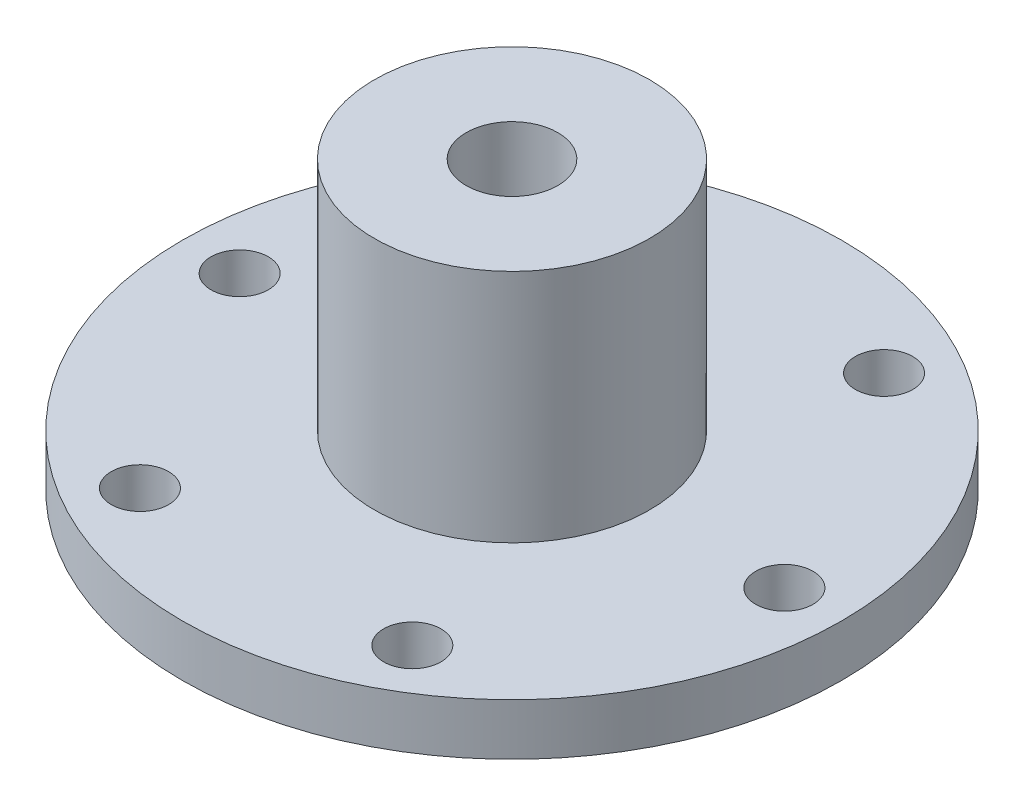
ISO-10303-21;
HEADER;
FILE_DESCRIPTION(('STEP AP214'),'2;1');
FILE_NAME('part.step','',(''),(''),'','','');
FILE_SCHEMA(('AUTOMOTIVE_DESIGN { 1 0 10303 214 1 1 1 1 }'));
ENDSEC;
DATA;
#1=APPLICATION_CONTEXT('core data for automotive mechanical design processes');
#2=APPLICATION_PROTOCOL_DEFINITION('international standard','automotive_design',2000,#1);
#3=PRODUCT_CONTEXT('',#1,'mechanical');
#4=PRODUCT('Part','Part','',(#3));
#5=PRODUCT_RELATED_PRODUCT_CATEGORY('part','',(#4));
#6=PRODUCT_DEFINITION_FORMATION('','',#4);
#7=PRODUCT_DEFINITION_CONTEXT('part definition',#1,'design');
#8=PRODUCT_DEFINITION('design','',#6,#7);
#9=PRODUCT_DEFINITION_SHAPE('','',#8);
#10=(LENGTH_UNIT() NAMED_UNIT(*) SI_UNIT(.MILLI.,.METRE.));
#11=(NAMED_UNIT(*) PLANE_ANGLE_UNIT() SI_UNIT($,.RADIAN.));
#12=(NAMED_UNIT(*) SI_UNIT($,.STERADIAN.) SOLID_ANGLE_UNIT());
#13=UNCERTAINTY_MEASURE_WITH_UNIT(LENGTH_MEASURE(1.E-05),#10,'distance_accuracy_value','');
#14=(GEOMETRIC_REPRESENTATION_CONTEXT(3) GLOBAL_UNCERTAINTY_ASSIGNED_CONTEXT((#13)) GLOBAL_UNIT_ASSIGNED_CONTEXT((#10,
#11,#12)) REPRESENTATION_CONTEXT('',''));
#15=CARTESIAN_POINT('',(0.,0.,0.));
#16=DIRECTION('',(0.,0.,1.));
#17=DIRECTION('',(1.,0.,0.));
#18=AXIS2_PLACEMENT_3D('',#15,#16,#17);
#19=CARTESIAN_POINT('',(0.,0.,0.));
#20=DIRECTION('',(0.,-1.,0.));
#21=DIRECTION('',(0.,0.,-1.));
#22=AXIS2_PLACEMENT_3D('',#19,#20,#21);
#23=CYLINDRICAL_SURFACE('',#22,4.);
#24=CARTESIAN_POINT('',(0.,0.,0.));
#25=DIRECTION('',(0.,-1.,0.));
#26=DIRECTION('',(0.,0.,-1.));
#27=AXIS2_PLACEMENT_3D('',#24,#25,#26);
#28=CIRCLE('',#27,4.);
#29=CARTESIAN_POINT('',(0.,0.,-4.));
#30=VERTEX_POINT('',#29);
#31=EDGE_CURVE('E10',#30,#30,#28,.T.);
#32=ORIENTED_EDGE('',*,*,#31,.T.);
#33=EDGE_LOOP('',(#32));
#34=FACE_BOUND('',#33,.T.);
#35=CARTESIAN_POINT('',(0.,25.,0.));
#36=DIRECTION('',(0.,-1.,0.));
#37=DIRECTION('',(0.,0.,-1.));
#38=AXIS2_PLACEMENT_3D('',#35,#36,#37);
#39=CIRCLE('',#38,4.);
#40=CARTESIAN_POINT('',(0.,25.,-4.));
#41=VERTEX_POINT('',#40);
#42=EDGE_CURVE('E66',#41,#41,#39,.T.);
#43=ORIENTED_EDGE('',*,*,#42,.F.);
#44=EDGE_LOOP('',(#43));
#45=FACE_BOUND('',#44,.T.);
#46=ADVANCED_FACE('F33',(#34,#45),#23,.F.);
#47=CARTESIAN_POINT('',(4.,0.,0.));
#48=DIRECTION('',(0.,-1.,0.));
#49=DIRECTION('',(0.,0.,-1.));
#50=AXIS2_PLACEMENT_3D('',#47,#48,#49);
#51=PLANE('',#50);
#52=CARTESIAN_POINT('',(23.75,0.,0.));
#53=DIRECTION('',(0.,-1.,0.));
#54=DIRECTION('',(0.,0.,-1.));
#55=AXIS2_PLACEMENT_3D('',#52,#53,#54);
#56=CIRCLE('',#55,2.5);
#57=CARTESIAN_POINT('',(23.75,0.,-2.5));
#58=VERTEX_POINT('',#57);
#59=EDGE_CURVE('E53',#58,#58,#56,.T.);
#60=ORIENTED_EDGE('',*,*,#59,.F.);
#61=EDGE_LOOP('',(#60));
#62=FACE_BOUND('',#61,.T.);
#63=CARTESIAN_POINT('',(11.8750000000002,0.,20.5681033398803));
#64=DIRECTION('',(0.,-1.,0.));
#65=DIRECTION('',(0.,0.,-1.));
#66=AXIS2_PLACEMENT_3D('',#63,#64,#65);
#67=CIRCLE('',#66,2.5);
#68=CARTESIAN_POINT('',(11.8750000000002,0.,18.0681033398803));
#69=VERTEX_POINT('',#68);
#70=EDGE_CURVE('E117',#69,#69,#67,.T.);
#71=ORIENTED_EDGE('',*,*,#70,.F.);
#72=EDGE_LOOP('',(#71));
#73=FACE_BOUND('',#72,.T.);
#74=CARTESIAN_POINT('',(-11.8749999999998,0.,20.5681033398805));
#75=DIRECTION('',(0.,-1.,0.));
#76=DIRECTION('',(0.,0.,-1.));
#77=AXIS2_PLACEMENT_3D('',#74,#75,#76);
#78=CIRCLE('',#77,2.5);
#79=CARTESIAN_POINT('',(-11.8749999999998,0.,18.0681033398805));
#80=VERTEX_POINT('',#79);
#81=EDGE_CURVE('E121',#80,#80,#78,.T.);
#82=ORIENTED_EDGE('',*,*,#81,.F.);
#83=EDGE_LOOP('',(#82));
#84=FACE_BOUND('',#83,.T.);
#85=CARTESIAN_POINT('',(11.8749999999997,0.,-20.5681033398806));
#86=DIRECTION('',(0.,-1.,0.));
#87=DIRECTION('',(0.,0.,-1.));
#88=AXIS2_PLACEMENT_3D('',#85,#86,#87);
#89=CIRCLE('',#88,2.5);
#90=CARTESIAN_POINT('',(11.8749999999997,0.,-23.0681033398806));
#91=VERTEX_POINT('',#90);
#92=EDGE_CURVE('E78',#91,#91,#89,.T.);
#93=ORIENTED_EDGE('',*,*,#92,.F.);
#94=EDGE_LOOP('',(#93));
#95=FACE_BOUND('',#94,.T.);
#96=CARTESIAN_POINT('',(-11.8750000000001,0.,-20.5681033398804));
#97=DIRECTION('',(0.,-1.,0.));
#98=DIRECTION('',(0.,0.,-1.));
#99=AXIS2_PLACEMENT_3D('',#96,#97,#98);
#100=CIRCLE('',#99,2.49999999999999);
#101=CARTESIAN_POINT('',(-11.8750000000001,0.,-23.0681033398804));
#102=VERTEX_POINT('',#101);
#103=EDGE_CURVE('E128',#102,#102,#100,.T.);
#104=ORIENTED_EDGE('',*,*,#103,.F.);
#105=EDGE_LOOP('',(#104));
#106=FACE_BOUND('',#105,.T.);
#107=CARTESIAN_POINT('',(-23.75,0.,1.68210386814043E-13));
#108=DIRECTION('',(0.,-1.,0.));
#109=DIRECTION('',(0.,0.,-1.));
#110=AXIS2_PLACEMENT_3D('',#107,#108,#109);
#111=CIRCLE('',#110,2.5);
#112=CARTESIAN_POINT('',(-23.75,0.,-2.49999999999983));
#113=VERTEX_POINT('',#112);
#114=EDGE_CURVE('E132',#113,#113,#111,.T.);
#115=ORIENTED_EDGE('',*,*,#114,.F.);
#116=EDGE_LOOP('',(#115));
#117=FACE_BOUND('',#116,.T.);
#118=CARTESIAN_POINT('',(0.,0.,0.));
#119=DIRECTION('',(0.,-1.,0.));
#120=DIRECTION('',(0.,0.,-1.));
#121=AXIS2_PLACEMENT_3D('',#118,#119,#120);
#122=CIRCLE('',#121,28.75);
#123=CARTESIAN_POINT('',(0.,0.,-28.75));
#124=VERTEX_POINT('',#123);
#125=EDGE_CURVE('E40',#124,#124,#122,.T.);
#126=ORIENTED_EDGE('',*,*,#125,.T.);
#127=EDGE_LOOP('',(#126));
#128=FACE_BOUND('',#127,.T.);
#129=ORIENTED_EDGE('',*,*,#31,.F.);
#130=EDGE_LOOP('',(#129));
#131=FACE_BOUND('',#130,.T.);
#132=ADVANCED_FACE('F100',(#62,#73,#84,#95,#106,#117,#128,#131),#51,.T.);
#133=CARTESIAN_POINT('',(0.,0.,0.));
#134=DIRECTION('',(0.,-1.,0.));
#135=DIRECTION('',(0.,0.,-1.));
#136=AXIS2_PLACEMENT_3D('',#133,#134,#135);
#137=CYLINDRICAL_SURFACE('',#136,28.75);
#138=CARTESIAN_POINT('',(0.,4.5,0.));
#139=DIRECTION('',(0.,-1.,0.));
#140=DIRECTION('',(0.,0.,-1.));
#141=AXIS2_PLACEMENT_3D('',#138,#139,#140);
#142=CIRCLE('',#141,28.75);
#143=CARTESIAN_POINT('',(0.,4.5,-28.75));
#144=VERTEX_POINT('',#143);
#145=EDGE_CURVE('E45',#144,#144,#142,.T.);
#146=ORIENTED_EDGE('',*,*,#145,.T.);
#147=EDGE_LOOP('',(#146));
#148=FACE_BOUND('',#147,.T.);
#149=ORIENTED_EDGE('',*,*,#125,.F.);
#150=EDGE_LOOP('',(#149));
#151=FACE_BOUND('',#150,.T.);
#152=ADVANCED_FACE('F85',(#148,#151),#137,.T.);
#153=CARTESIAN_POINT('',(28.75,4.5,0.));
#154=DIRECTION('',(0.,1.,0.));
#155=DIRECTION('',(0.,0.,1.));
#156=AXIS2_PLACEMENT_3D('',#153,#154,#155);
#157=PLANE('',#156);
#158=CARTESIAN_POINT('',(23.75,4.5,0.));
#159=DIRECTION('',(0.,1.,0.));
#160=DIRECTION('',(0.,0.,1.));
#161=AXIS2_PLACEMENT_3D('',#158,#159,#160);
#162=CIRCLE('',#161,2.5);
#163=CARTESIAN_POINT('',(23.75,4.5,-2.5));
#164=VERTEX_POINT('',#163);
#165=EDGE_CURVE('E36',#164,#164,#162,.T.);
#166=ORIENTED_EDGE('',*,*,#165,.F.);
#167=EDGE_LOOP('',(#166));
#168=FACE_BOUND('',#167,.T.);
#169=CARTESIAN_POINT('',(11.8750000000002,4.5,20.5681033398803));
#170=DIRECTION('',(0.,1.,0.));
#171=DIRECTION('',(0.,0.,1.));
#172=AXIS2_PLACEMENT_3D('',#169,#170,#171);
#173=CIRCLE('',#172,2.5);
#174=CARTESIAN_POINT('',(11.8750000000002,4.5,18.0681033398803));
#175=VERTEX_POINT('',#174);
#176=EDGE_CURVE('E61',#175,#175,#173,.T.);
#177=ORIENTED_EDGE('',*,*,#176,.F.);
#178=EDGE_LOOP('',(#177));
#179=FACE_BOUND('',#178,.T.);
#180=CARTESIAN_POINT('',(-11.8749999999998,4.5,20.5681033398805));
#181=DIRECTION('',(0.,1.,0.));
#182=DIRECTION('',(0.,0.,1.));
#183=AXIS2_PLACEMENT_3D('',#180,#181,#182);
#184=CIRCLE('',#183,2.5);
#185=CARTESIAN_POINT('',(-11.8749999999998,4.5,18.0681033398805));
#186=VERTEX_POINT('',#185);
#187=EDGE_CURVE('E59',#186,#186,#184,.T.);
#188=ORIENTED_EDGE('',*,*,#187,.F.);
#189=EDGE_LOOP('',(#188));
#190=FACE_BOUND('',#189,.T.);
#191=CARTESIAN_POINT('',(11.8749999999997,4.5,-20.5681033398806));
#192=DIRECTION('',(0.,1.,0.));
#193=DIRECTION('',(0.,0.,1.));
#194=AXIS2_PLACEMENT_3D('',#191,#192,#193);
#195=CIRCLE('',#194,2.5);
#196=CARTESIAN_POINT('',(11.8749999999997,4.5,-23.0681033398806));
#197=VERTEX_POINT('',#196);
#198=EDGE_CURVE('E56',#197,#197,#195,.T.);
#199=ORIENTED_EDGE('',*,*,#198,.F.);
#200=EDGE_LOOP('',(#199));
#201=FACE_BOUND('',#200,.T.);
#202=CARTESIAN_POINT('',(-11.8750000000001,4.5,-20.5681033398804));
#203=DIRECTION('',(0.,1.,0.));
#204=DIRECTION('',(0.,0.,1.));
#205=AXIS2_PLACEMENT_3D('',#202,#203,#204);
#206=CIRCLE('',#205,2.49999999999999);
#207=CARTESIAN_POINT('',(-11.8750000000001,4.5,-23.0681033398804));
#208=VERTEX_POINT('',#207);
#209=EDGE_CURVE('E52',#208,#208,#206,.T.);
#210=ORIENTED_EDGE('',*,*,#209,.F.);
#211=EDGE_LOOP('',(#210));
#212=FACE_BOUND('',#211,.T.);
#213=CARTESIAN_POINT('',(-23.75,4.5,1.68210386814043E-13));
#214=DIRECTION('',(0.,1.,0.));
#215=DIRECTION('',(0.,0.,1.));
#216=AXIS2_PLACEMENT_3D('',#213,#214,#215);
#217=CIRCLE('',#216,2.5);
#218=CARTESIAN_POINT('',(-23.75,4.5,-2.49999999999983));
#219=VERTEX_POINT('',#218);
#220=EDGE_CURVE('E49',#219,#219,#217,.T.);
#221=ORIENTED_EDGE('',*,*,#220,.F.);
#222=EDGE_LOOP('',(#221));
#223=FACE_BOUND('',#222,.T.);
#224=CARTESIAN_POINT('',(0.,4.5,0.));
#225=DIRECTION('',(0.,-1.,0.));
#226=DIRECTION('',(0.,0.,-1.));
#227=AXIS2_PLACEMENT_3D('',#224,#225,#226);
#228=CIRCLE('',#227,12.);
#229=CARTESIAN_POINT('',(0.,4.5,-12.));
#230=VERTEX_POINT('',#229);
#231=EDGE_CURVE('E75',#230,#230,#228,.T.);
#232=ORIENTED_EDGE('',*,*,#231,.T.);
#233=EDGE_LOOP('',(#232));
#234=FACE_BOUND('',#233,.T.);
#235=ORIENTED_EDGE('',*,*,#145,.F.);
#236=EDGE_LOOP('',(#235));
#237=FACE_BOUND('',#236,.T.);
#238=ADVANCED_FACE('F88',(#168,#179,#190,#201,#212,#223,#234,#237),#157,.T.);
#239=CARTESIAN_POINT('',(0.,0.,0.));
#240=DIRECTION('',(0.,-1.,0.));
#241=DIRECTION('',(0.,0.,-1.));
#242=AXIS2_PLACEMENT_3D('',#239,#240,#241);
#243=CYLINDRICAL_SURFACE('',#242,12.);
#244=CARTESIAN_POINT('',(0.,25.,0.));
#245=DIRECTION('',(0.,-1.,0.));
#246=DIRECTION('',(0.,0.,-1.));
#247=AXIS2_PLACEMENT_3D('',#244,#245,#246);
#248=CIRCLE('',#247,12.);
#249=CARTESIAN_POINT('',(0.,25.,-12.));
#250=VERTEX_POINT('',#249);
#251=EDGE_CURVE('E70',#250,#250,#248,.T.);
#252=ORIENTED_EDGE('',*,*,#251,.T.);
#253=EDGE_LOOP('',(#252));
#254=FACE_BOUND('',#253,.T.);
#255=ORIENTED_EDGE('',*,*,#231,.F.);
#256=EDGE_LOOP('',(#255));
#257=FACE_BOUND('',#256,.T.);
#258=ADVANCED_FACE('F90',(#254,#257),#243,.T.);
#259=CARTESIAN_POINT('',(12.,25.,0.));
#260=DIRECTION('',(0.,1.,0.));
#261=DIRECTION('',(0.,0.,1.));
#262=AXIS2_PLACEMENT_3D('',#259,#260,#261);
#263=PLANE('',#262);
#264=ORIENTED_EDGE('',*,*,#42,.T.);
#265=EDGE_LOOP('',(#264));
#266=FACE_BOUND('',#265,.T.);
#267=ORIENTED_EDGE('',*,*,#251,.F.);
#268=EDGE_LOOP('',(#267));
#269=FACE_BOUND('',#268,.T.);
#270=ADVANCED_FACE('F97',(#266,#269),#263,.T.);
#271=CARTESIAN_POINT('',(-23.75,25.,1.68210386814043E-13));
#272=DIRECTION('',(0.,-1.,0.));
#273=DIRECTION('',(0.,0.,-1.));
#274=AXIS2_PLACEMENT_3D('',#271,#272,#273);
#275=CYLINDRICAL_SURFACE('',#274,2.5);
#276=CARTESIAN_POINT('',(-23.75,4.5,-2.49999999999983));
#277=CARTESIAN_POINT('',(-23.75,4.453125,-2.49999999999983));
#278=CARTESIAN_POINT('',(-23.75,4.40625,-2.49999999999983));
#279=CARTESIAN_POINT('',(-23.75,4.3125,-2.49999999999983));
#280=CARTESIAN_POINT('',(-23.75,4.265625,-2.49999999999983));
#281=CARTESIAN_POINT('',(-23.75,4.171875,-2.49999999999983));
#282=CARTESIAN_POINT('',(-23.75,4.125,-2.49999999999983));
#283=CARTESIAN_POINT('',(-23.75,4.03125,-2.49999999999983));
#284=CARTESIAN_POINT('',(-23.75,3.984375,-2.49999999999983));
#285=CARTESIAN_POINT('',(-23.75,3.890625,-2.49999999999983));
#286=CARTESIAN_POINT('',(-23.75,3.84375,-2.49999999999983));
#287=CARTESIAN_POINT('',(-23.75,3.75,-2.49999999999983));
#288=CARTESIAN_POINT('',(-23.75,3.703125,-2.49999999999983));
#289=CARTESIAN_POINT('',(-23.75,3.609375,-2.49999999999983));
#290=CARTESIAN_POINT('',(-23.75,3.5625,-2.49999999999983));
#291=CARTESIAN_POINT('',(-23.75,3.46875,-2.49999999999983));
#292=CARTESIAN_POINT('',(-23.75,3.421875,-2.49999999999983));
#293=CARTESIAN_POINT('',(-23.75,3.328125,-2.49999999999983));
#294=CARTESIAN_POINT('',(-23.75,3.28125,-2.49999999999983));
#295=CARTESIAN_POINT('',(-23.75,3.1875,-2.49999999999983));
#296=CARTESIAN_POINT('',(-23.75,3.140625,-2.49999999999983));
#297=CARTESIAN_POINT('',(-23.75,3.046875,-2.49999999999983));
#298=CARTESIAN_POINT('',(-23.75,3.,-2.49999999999983));
#299=CARTESIAN_POINT('',(-23.75,2.90625,-2.49999999999983));
#300=CARTESIAN_POINT('',(-23.75,2.859375,-2.49999999999983));
#301=CARTESIAN_POINT('',(-23.75,2.765625,-2.49999999999983));
#302=CARTESIAN_POINT('',(-23.75,2.71875,-2.49999999999983));
#303=CARTESIAN_POINT('',(-23.75,2.625,-2.49999999999983));
#304=CARTESIAN_POINT('',(-23.75,2.578125,-2.49999999999983));
#305=CARTESIAN_POINT('',(-23.75,2.484375,-2.49999999999983));
#306=CARTESIAN_POINT('',(-23.75,2.4375,-2.49999999999983));
#307=CARTESIAN_POINT('',(-23.75,2.34375,-2.49999999999983));
#308=CARTESIAN_POINT('',(-23.75,2.296875,-2.49999999999983));
#309=CARTESIAN_POINT('',(-23.75,2.203125,-2.49999999999983));
#310=CARTESIAN_POINT('',(-23.75,2.15625,-2.49999999999983));
#311=CARTESIAN_POINT('',(-23.75,2.0625,-2.49999999999983));
#312=CARTESIAN_POINT('',(-23.75,2.015625,-2.49999999999983));
#313=CARTESIAN_POINT('',(-23.75,1.921875,-2.49999999999983));
#314=CARTESIAN_POINT('',(-23.75,1.875,-2.49999999999983));
#315=CARTESIAN_POINT('',(-23.75,1.78125,-2.49999999999983));
#316=CARTESIAN_POINT('',(-23.75,1.734375,-2.49999999999983));
#317=CARTESIAN_POINT('',(-23.75,1.640625,-2.49999999999983));
#318=CARTESIAN_POINT('',(-23.75,1.59375,-2.49999999999983));
#319=CARTESIAN_POINT('',(-23.75,1.5,-2.49999999999983));
#320=CARTESIAN_POINT('',(-23.75,1.453125,-2.49999999999983));
#321=CARTESIAN_POINT('',(-23.75,1.359375,-2.49999999999983));
#322=CARTESIAN_POINT('',(-23.75,1.3125,-2.49999999999983));
#323=CARTESIAN_POINT('',(-23.75,1.21875,-2.49999999999983));
#324=CARTESIAN_POINT('',(-23.75,1.171875,-2.49999999999983));
#325=CARTESIAN_POINT('',(-23.75,1.078125,-2.49999999999983));
#326=CARTESIAN_POINT('',(-23.75,1.03125,-2.49999999999983));
#327=CARTESIAN_POINT('',(-23.75,0.9375,-2.49999999999983));
#328=CARTESIAN_POINT('',(-23.75,0.890625,-2.49999999999983));
#329=CARTESIAN_POINT('',(-23.75,0.796875,-2.49999999999983));
#330=CARTESIAN_POINT('',(-23.75,0.749999999999999,-2.49999999999983));
#331=CARTESIAN_POINT('',(-23.75,0.656249999999999,-2.49999999999983));
#332=CARTESIAN_POINT('',(-23.75,0.609375,-2.49999999999983));
#333=CARTESIAN_POINT('',(-23.75,0.515625,-2.49999999999983));
#334=CARTESIAN_POINT('',(-23.75,0.468749999999999,-2.49999999999983));
#335=CARTESIAN_POINT('',(-23.75,0.374999999999999,-2.49999999999983));
#336=CARTESIAN_POINT('',(-23.75,0.328125,-2.49999999999983));
#337=CARTESIAN_POINT('',(-23.75,0.234375,-2.49999999999983));
#338=CARTESIAN_POINT('',(-23.75,0.187499999999999,-2.49999999999983));
#339=CARTESIAN_POINT('',(-23.75,0.0937499999999989,-2.49999999999983));
#340=CARTESIAN_POINT('',(-23.75,0.0468749999999994,-2.49999999999983));
#341=CARTESIAN_POINT('',(-23.75,0.,-2.49999999999983));
#342=B_SPLINE_CURVE_WITH_KNOTS('',3,(#276,#277,#278,#279,#280,#281,#282,#283,#284,#285,#286,
#287,#288,#289,#290,#291,#292,#293,#294,#295,#296,#297,#298,#299,#300,#301,#302,#303,#304,#305,
#306,#307,#308,#309,#310,#311,#312,#313,#314,#315,#316,#317,#318,#319,#320,#321,#322,#323,#324,
#325,#326,#327,#328,#329,#330,#331,#332,#333,#334,#335,#336,#337,#338,#339,#340,#341),
.UNSPECIFIED.,.F.,.F.,(4,2,2,2,2,2,2,2,2,2,2,2,2,2,2,2,2,2,2,2,2,2,2,2,2,2,2,2,2,2,2,2,4),(0.,
0.140624999999998,0.28125,0.421874999999999,0.5625,0.703124999999999,0.843750000000001,
0.984374999999999,1.125,1.265625,1.40625,1.546875,1.6875,1.828125,1.96875,2.109375,2.25,
2.390625,2.53125,2.671875,2.8125,2.953125,3.09375,3.234375,3.375,3.515625,3.65625,3.796875,
3.9375,4.078125,4.21875,4.359375,4.5),.UNSPECIFIED.);
#343=EDGE_CURVE('BSEAM155',#219,#113,#342,.T.);
#344=ORIENTED_EDGE('',*,*,#220,.T.);
#345=ORIENTED_EDGE('',*,*,#114,.T.);
#346=ORIENTED_EDGE('',*,*,#343,.T.);
#347=ORIENTED_EDGE('',*,*,#343,.F.);
#348=EDGE_LOOP('',(#344,#346,#345,#347));
#349=FACE_BOUND('',#348,.T.);
#350=ADVANCED_FACE('F155',(#349),#275,.F.);
#351=CARTESIAN_POINT('',(-11.8750000000001,25.,-20.5681033398804));
#352=DIRECTION('',(0.,-1.,0.));
#353=DIRECTION('',(0.,0.,-1.));
#354=AXIS2_PLACEMENT_3D('',#351,#352,#353);
#355=CYLINDRICAL_SURFACE('',#354,2.49999999999999);
#356=CARTESIAN_POINT('',(-11.8750000000001,4.5,-23.0681033398804));
#357=CARTESIAN_POINT('',(-11.8750000000001,4.453125,-23.0681033398804));
#358=CARTESIAN_POINT('',(-11.8750000000001,4.40625,-23.0681033398804));
#359=CARTESIAN_POINT('',(-11.8750000000001,4.3125,-23.0681033398804));
#360=CARTESIAN_POINT('',(-11.8750000000001,4.265625,-23.0681033398804));
#361=CARTESIAN_POINT('',(-11.8750000000001,4.171875,-23.0681033398804));
#362=CARTESIAN_POINT('',(-11.8750000000001,4.125,-23.0681033398804));
#363=CARTESIAN_POINT('',(-11.8750000000001,4.03125,-23.0681033398804));
#364=CARTESIAN_POINT('',(-11.8750000000001,3.984375,-23.0681033398804));
#365=CARTESIAN_POINT('',(-11.8750000000001,3.890625,-23.0681033398804));
#366=CARTESIAN_POINT('',(-11.8750000000001,3.84375,-23.0681033398804));
#367=CARTESIAN_POINT('',(-11.8750000000001,3.75,-23.0681033398804));
#368=CARTESIAN_POINT('',(-11.8750000000001,3.703125,-23.0681033398804));
#369=CARTESIAN_POINT('',(-11.8750000000001,3.609375,-23.0681033398804));
#370=CARTESIAN_POINT('',(-11.8750000000001,3.5625,-23.0681033398804));
#371=CARTESIAN_POINT('',(-11.8750000000001,3.46875,-23.0681033398804));
#372=CARTESIAN_POINT('',(-11.8750000000001,3.421875,-23.0681033398804));
#373=CARTESIAN_POINT('',(-11.8750000000001,3.328125,-23.0681033398804));
#374=CARTESIAN_POINT('',(-11.8750000000001,3.28125,-23.0681033398804));
#375=CARTESIAN_POINT('',(-11.8750000000001,3.1875,-23.0681033398804));
#376=CARTESIAN_POINT('',(-11.8750000000001,3.140625,-23.0681033398804));
#377=CARTESIAN_POINT('',(-11.8750000000001,3.046875,-23.0681033398804));
#378=CARTESIAN_POINT('',(-11.8750000000001,3.,-23.0681033398804));
#379=CARTESIAN_POINT('',(-11.8750000000001,2.90625,-23.0681033398804));
#380=CARTESIAN_POINT('',(-11.8750000000001,2.859375,-23.0681033398804));
#381=CARTESIAN_POINT('',(-11.8750000000001,2.765625,-23.0681033398804));
#382=CARTESIAN_POINT('',(-11.8750000000001,2.71875,-23.0681033398804));
#383=CARTESIAN_POINT('',(-11.8750000000001,2.625,-23.0681033398804));
#384=CARTESIAN_POINT('',(-11.8750000000001,2.578125,-23.0681033398804));
#385=CARTESIAN_POINT('',(-11.8750000000001,2.484375,-23.0681033398804));
#386=CARTESIAN_POINT('',(-11.8750000000001,2.4375,-23.0681033398804));
#387=CARTESIAN_POINT('',(-11.8750000000001,2.34375,-23.0681033398804));
#388=CARTESIAN_POINT('',(-11.8750000000001,2.296875,-23.0681033398804));
#389=CARTESIAN_POINT('',(-11.8750000000001,2.203125,-23.0681033398804));
#390=CARTESIAN_POINT('',(-11.8750000000001,2.15625,-23.0681033398804));
#391=CARTESIAN_POINT('',(-11.8750000000001,2.0625,-23.0681033398804));
#392=CARTESIAN_POINT('',(-11.8750000000001,2.015625,-23.0681033398804));
#393=CARTESIAN_POINT('',(-11.8750000000001,1.921875,-23.0681033398804));
#394=CARTESIAN_POINT('',(-11.8750000000001,1.875,-23.0681033398804));
#395=CARTESIAN_POINT('',(-11.8750000000001,1.78125,-23.0681033398804));
#396=CARTESIAN_POINT('',(-11.8750000000001,1.734375,-23.0681033398804));
#397=CARTESIAN_POINT('',(-11.8750000000001,1.640625,-23.0681033398804));
#398=CARTESIAN_POINT('',(-11.8750000000001,1.59375,-23.0681033398804));
#399=CARTESIAN_POINT('',(-11.8750000000001,1.5,-23.0681033398804));
#400=CARTESIAN_POINT('',(-11.8750000000001,1.453125,-23.0681033398804));
#401=CARTESIAN_POINT('',(-11.8750000000001,1.359375,-23.0681033398804));
#402=CARTESIAN_POINT('',(-11.8750000000001,1.3125,-23.0681033398804));
#403=CARTESIAN_POINT('',(-11.8750000000001,1.21875,-23.0681033398804));
#404=CARTESIAN_POINT('',(-11.8750000000001,1.171875,-23.0681033398804));
#405=CARTESIAN_POINT('',(-11.8750000000001,1.078125,-23.0681033398804));
#406=CARTESIAN_POINT('',(-11.8750000000001,1.03125,-23.0681033398804));
#407=CARTESIAN_POINT('',(-11.8750000000001,0.9375,-23.0681033398804));
#408=CARTESIAN_POINT('',(-11.8750000000001,0.890625,-23.0681033398804));
#409=CARTESIAN_POINT('',(-11.8750000000001,0.796875,-23.0681033398804));
#410=CARTESIAN_POINT('',(-11.8750000000001,0.749999999999999,-23.0681033398804));
#411=CARTESIAN_POINT('',(-11.8750000000001,0.656249999999999,-23.0681033398804));
#412=CARTESIAN_POINT('',(-11.8750000000001,0.609375,-23.0681033398804));
#413=CARTESIAN_POINT('',(-11.8750000000001,0.515625,-23.0681033398804));
#414=CARTESIAN_POINT('',(-11.8750000000001,0.468749999999999,-23.0681033398804));
#415=CARTESIAN_POINT('',(-11.8750000000001,0.374999999999999,-23.0681033398804));
#416=CARTESIAN_POINT('',(-11.8750000000001,0.328125,-23.0681033398804));
#417=CARTESIAN_POINT('',(-11.8750000000001,0.234375,-23.0681033398804));
#418=CARTESIAN_POINT('',(-11.8750000000001,0.187499999999999,-23.0681033398804));
#419=CARTESIAN_POINT('',(-11.8750000000001,0.0937499999999989,-23.0681033398804));
#420=CARTESIAN_POINT('',(-11.8750000000001,0.0468749999999994,-23.0681033398804));
#421=CARTESIAN_POINT('',(-11.8750000000001,0.,-23.0681033398804));
#422=B_SPLINE_CURVE_WITH_KNOTS('',3,(#356,#357,#358,#359,#360,#361,#362,#363,#364,#365,#366,
#367,#368,#369,#370,#371,#372,#373,#374,#375,#376,#377,#378,#379,#380,#381,#382,#383,#384,#385,
#386,#387,#388,#389,#390,#391,#392,#393,#394,#395,#396,#397,#398,#399,#400,#401,#402,#403,#404,
#405,#406,#407,#408,#409,#410,#411,#412,#413,#414,#415,#416,#417,#418,#419,#420,#421),
.UNSPECIFIED.,.F.,.F.,(4,2,2,2,2,2,2,2,2,2,2,2,2,2,2,2,2,2,2,2,2,2,2,2,2,2,2,2,2,2,2,2,4),(0.,
0.140624999999998,0.28125,0.421874999999999,0.5625,0.703124999999999,0.843750000000001,
0.984374999999999,1.125,1.265625,1.40625,1.546875,1.6875,1.828125,1.96875,2.109375,2.25,
2.390625,2.53125,2.671875,2.8125,2.953125,3.09375,3.234375,3.375,3.515625,3.65625,3.796875,
3.9375,4.078125,4.21875,4.359375,4.5),.UNSPECIFIED.);
#423=EDGE_CURVE('BSEAM145',#208,#102,#422,.T.);
#424=ORIENTED_EDGE('',*,*,#209,.T.);
#425=ORIENTED_EDGE('',*,*,#103,.T.);
#426=ORIENTED_EDGE('',*,*,#423,.T.);
#427=ORIENTED_EDGE('',*,*,#423,.F.);
#428=EDGE_LOOP('',(#424,#426,#425,#427));
#429=FACE_BOUND('',#428,.T.);
#430=ADVANCED_FACE('F145',(#429),#355,.F.);
#431=CARTESIAN_POINT('',(11.8749999999997,25.,-20.5681033398806));
#432=DIRECTION('',(0.,-1.,0.));
#433=DIRECTION('',(0.,0.,-1.));
#434=AXIS2_PLACEMENT_3D('',#431,#432,#433);
#435=CYLINDRICAL_SURFACE('',#434,2.5);
#436=CARTESIAN_POINT('',(11.8749999999997,4.5,-23.0681033398806));
#437=CARTESIAN_POINT('',(11.8749999999997,4.453125,-23.0681033398806));
#438=CARTESIAN_POINT('',(11.8749999999997,4.40625,-23.0681033398806));
#439=CARTESIAN_POINT('',(11.8749999999997,4.3125,-23.0681033398806));
#440=CARTESIAN_POINT('',(11.8749999999997,4.265625,-23.0681033398806));
#441=CARTESIAN_POINT('',(11.8749999999997,4.171875,-23.0681033398806));
#442=CARTESIAN_POINT('',(11.8749999999997,4.125,-23.0681033398806));
#443=CARTESIAN_POINT('',(11.8749999999997,4.03125,-23.0681033398806));
#444=CARTESIAN_POINT('',(11.8749999999997,3.984375,-23.0681033398806));
#445=CARTESIAN_POINT('',(11.8749999999997,3.890625,-23.0681033398806));
#446=CARTESIAN_POINT('',(11.8749999999997,3.84375,-23.0681033398806));
#447=CARTESIAN_POINT('',(11.8749999999997,3.75,-23.0681033398806));
#448=CARTESIAN_POINT('',(11.8749999999997,3.703125,-23.0681033398806));
#449=CARTESIAN_POINT('',(11.8749999999997,3.609375,-23.0681033398806));
#450=CARTESIAN_POINT('',(11.8749999999997,3.5625,-23.0681033398806));
#451=CARTESIAN_POINT('',(11.8749999999997,3.46875,-23.0681033398806));
#452=CARTESIAN_POINT('',(11.8749999999997,3.421875,-23.0681033398806));
#453=CARTESIAN_POINT('',(11.8749999999997,3.328125,-23.0681033398806));
#454=CARTESIAN_POINT('',(11.8749999999997,3.28125,-23.0681033398806));
#455=CARTESIAN_POINT('',(11.8749999999997,3.1875,-23.0681033398806));
#456=CARTESIAN_POINT('',(11.8749999999997,3.140625,-23.0681033398806));
#457=CARTESIAN_POINT('',(11.8749999999997,3.046875,-23.0681033398806));
#458=CARTESIAN_POINT('',(11.8749999999997,3.,-23.0681033398806));
#459=CARTESIAN_POINT('',(11.8749999999997,2.90625,-23.0681033398806));
#460=CARTESIAN_POINT('',(11.8749999999997,2.859375,-23.0681033398806));
#461=CARTESIAN_POINT('',(11.8749999999997,2.765625,-23.0681033398806));
#462=CARTESIAN_POINT('',(11.8749999999997,2.71875,-23.0681033398806));
#463=CARTESIAN_POINT('',(11.8749999999997,2.625,-23.0681033398806));
#464=CARTESIAN_POINT('',(11.8749999999997,2.578125,-23.0681033398806));
#465=CARTESIAN_POINT('',(11.8749999999997,2.484375,-23.0681033398806));
#466=CARTESIAN_POINT('',(11.8749999999997,2.4375,-23.0681033398806));
#467=CARTESIAN_POINT('',(11.8749999999997,2.34375,-23.0681033398806));
#468=CARTESIAN_POINT('',(11.8749999999997,2.296875,-23.0681033398806));
#469=CARTESIAN_POINT('',(11.8749999999997,2.203125,-23.0681033398806));
#470=CARTESIAN_POINT('',(11.8749999999997,2.15625,-23.0681033398806));
#471=CARTESIAN_POINT('',(11.8749999999997,2.0625,-23.0681033398806));
#472=CARTESIAN_POINT('',(11.8749999999997,2.015625,-23.0681033398806));
#473=CARTESIAN_POINT('',(11.8749999999997,1.921875,-23.0681033398806));
#474=CARTESIAN_POINT('',(11.8749999999997,1.875,-23.0681033398806));
#475=CARTESIAN_POINT('',(11.8749999999997,1.78125,-23.0681033398806));
#476=CARTESIAN_POINT('',(11.8749999999997,1.734375,-23.0681033398806));
#477=CARTESIAN_POINT('',(11.8749999999997,1.640625,-23.0681033398806));
#478=CARTESIAN_POINT('',(11.8749999999997,1.59375,-23.0681033398806));
#479=CARTESIAN_POINT('',(11.8749999999997,1.5,-23.0681033398806));
#480=CARTESIAN_POINT('',(11.8749999999997,1.453125,-23.0681033398806));
#481=CARTESIAN_POINT('',(11.8749999999997,1.359375,-23.0681033398806));
#482=CARTESIAN_POINT('',(11.8749999999997,1.3125,-23.0681033398806));
#483=CARTESIAN_POINT('',(11.8749999999997,1.21875,-23.0681033398806));
#484=CARTESIAN_POINT('',(11.8749999999997,1.171875,-23.0681033398806));
#485=CARTESIAN_POINT('',(11.8749999999997,1.078125,-23.0681033398806));
#486=CARTESIAN_POINT('',(11.8749999999997,1.03125,-23.0681033398806));
#487=CARTESIAN_POINT('',(11.8749999999997,0.9375,-23.0681033398806));
#488=CARTESIAN_POINT('',(11.8749999999997,0.890625,-23.0681033398806));
#489=CARTESIAN_POINT('',(11.8749999999997,0.796875,-23.0681033398806));
#490=CARTESIAN_POINT('',(11.8749999999997,0.749999999999999,-23.0681033398806));
#491=CARTESIAN_POINT('',(11.8749999999997,0.656249999999999,-23.0681033398806));
#492=CARTESIAN_POINT('',(11.8749999999997,0.609375,-23.0681033398806));
#493=CARTESIAN_POINT('',(11.8749999999997,0.515625,-23.0681033398806));
#494=CARTESIAN_POINT('',(11.8749999999997,0.468749999999999,-23.0681033398806));
#495=CARTESIAN_POINT('',(11.8749999999997,0.374999999999999,-23.0681033398806));
#496=CARTESIAN_POINT('',(11.8749999999997,0.328125,-23.0681033398806));
#497=CARTESIAN_POINT('',(11.8749999999997,0.234375,-23.0681033398806));
#498=CARTESIAN_POINT('',(11.8749999999997,0.187499999999999,-23.0681033398806));
#499=CARTESIAN_POINT('',(11.8749999999997,0.0937499999999989,-23.0681033398806));
#500=CARTESIAN_POINT('',(11.8749999999997,0.0468749999999994,-23.0681033398806));
#501=CARTESIAN_POINT('',(11.8749999999997,0.,-23.0681033398806));
#502=B_SPLINE_CURVE_WITH_KNOTS('',3,(#436,#437,#438,#439,#440,#441,#442,#443,#444,#445,#446,
#447,#448,#449,#450,#451,#452,#453,#454,#455,#456,#457,#458,#459,#460,#461,#462,#463,#464,#465,
#466,#467,#468,#469,#470,#471,#472,#473,#474,#475,#476,#477,#478,#479,#480,#481,#482,#483,#484,
#485,#486,#487,#488,#489,#490,#491,#492,#493,#494,#495,#496,#497,#498,#499,#500,#501),
.UNSPECIFIED.,.F.,.F.,(4,2,2,2,2,2,2,2,2,2,2,2,2,2,2,2,2,2,2,2,2,2,2,2,2,2,2,2,2,2,2,2,4),(0.,
0.140624999999998,0.28125,0.421874999999999,0.5625,0.703124999999999,0.843750000000001,
0.984374999999999,1.125,1.265625,1.40625,1.546875,1.6875,1.828125,1.96875,2.109375,2.25,
2.390625,2.53125,2.671875,2.8125,2.953125,3.09375,3.234375,3.375,3.515625,3.65625,3.796875,
3.9375,4.078125,4.21875,4.359375,4.5),.UNSPECIFIED.);
#503=EDGE_CURVE('BSEAM142',#197,#91,#502,.T.);
#504=ORIENTED_EDGE('',*,*,#198,.T.);
#505=ORIENTED_EDGE('',*,*,#92,.T.);
#506=ORIENTED_EDGE('',*,*,#503,.T.);
#507=ORIENTED_EDGE('',*,*,#503,.F.);
#508=EDGE_LOOP('',(#504,#506,#505,#507));
#509=FACE_BOUND('',#508,.T.);
#510=ADVANCED_FACE('F142',(#509),#435,.F.);
#511=CARTESIAN_POINT('',(-11.8749999999998,25.,20.5681033398805));
#512=DIRECTION('',(0.,-1.,0.));
#513=DIRECTION('',(0.,0.,-1.));
#514=AXIS2_PLACEMENT_3D('',#511,#512,#513);
#515=CYLINDRICAL_SURFACE('',#514,2.5);
#516=CARTESIAN_POINT('',(-11.8749999999998,4.5,18.0681033398805));
#517=CARTESIAN_POINT('',(-11.8749999999998,4.453125,18.0681033398805));
#518=CARTESIAN_POINT('',(-11.8749999999998,4.40625,18.0681033398805));
#519=CARTESIAN_POINT('',(-11.8749999999998,4.3125,18.0681033398805));
#520=CARTESIAN_POINT('',(-11.8749999999998,4.265625,18.0681033398805));
#521=CARTESIAN_POINT('',(-11.8749999999998,4.171875,18.0681033398805));
#522=CARTESIAN_POINT('',(-11.8749999999998,4.125,18.0681033398805));
#523=CARTESIAN_POINT('',(-11.8749999999998,4.03125,18.0681033398805));
#524=CARTESIAN_POINT('',(-11.8749999999998,3.984375,18.0681033398805));
#525=CARTESIAN_POINT('',(-11.8749999999998,3.890625,18.0681033398805));
#526=CARTESIAN_POINT('',(-11.8749999999998,3.84375,18.0681033398805));
#527=CARTESIAN_POINT('',(-11.8749999999998,3.75,18.0681033398805));
#528=CARTESIAN_POINT('',(-11.8749999999998,3.703125,18.0681033398805));
#529=CARTESIAN_POINT('',(-11.8749999999998,3.609375,18.0681033398805));
#530=CARTESIAN_POINT('',(-11.8749999999998,3.5625,18.0681033398805));
#531=CARTESIAN_POINT('',(-11.8749999999998,3.46875,18.0681033398805));
#532=CARTESIAN_POINT('',(-11.8749999999998,3.421875,18.0681033398805));
#533=CARTESIAN_POINT('',(-11.8749999999998,3.328125,18.0681033398805));
#534=CARTESIAN_POINT('',(-11.8749999999998,3.28125,18.0681033398805));
#535=CARTESIAN_POINT('',(-11.8749999999998,3.1875,18.0681033398805));
#536=CARTESIAN_POINT('',(-11.8749999999998,3.140625,18.0681033398805));
#537=CARTESIAN_POINT('',(-11.8749999999998,3.046875,18.0681033398805));
#538=CARTESIAN_POINT('',(-11.8749999999998,3.,18.0681033398805));
#539=CARTESIAN_POINT('',(-11.8749999999998,2.90625,18.0681033398805));
#540=CARTESIAN_POINT('',(-11.8749999999998,2.859375,18.0681033398805));
#541=CARTESIAN_POINT('',(-11.8749999999998,2.765625,18.0681033398805));
#542=CARTESIAN_POINT('',(-11.8749999999998,2.71875,18.0681033398805));
#543=CARTESIAN_POINT('',(-11.8749999999998,2.625,18.0681033398805));
#544=CARTESIAN_POINT('',(-11.8749999999998,2.578125,18.0681033398805));
#545=CARTESIAN_POINT('',(-11.8749999999998,2.484375,18.0681033398805));
#546=CARTESIAN_POINT('',(-11.8749999999998,2.4375,18.0681033398805));
#547=CARTESIAN_POINT('',(-11.8749999999998,2.34375,18.0681033398805));
#548=CARTESIAN_POINT('',(-11.8749999999998,2.296875,18.0681033398805));
#549=CARTESIAN_POINT('',(-11.8749999999998,2.203125,18.0681033398805));
#550=CARTESIAN_POINT('',(-11.8749999999998,2.15625,18.0681033398805));
#551=CARTESIAN_POINT('',(-11.8749999999998,2.0625,18.0681033398805));
#552=CARTESIAN_POINT('',(-11.8749999999998,2.015625,18.0681033398805));
#553=CARTESIAN_POINT('',(-11.8749999999998,1.921875,18.0681033398805));
#554=CARTESIAN_POINT('',(-11.8749999999998,1.875,18.0681033398805));
#555=CARTESIAN_POINT('',(-11.8749999999998,1.78125,18.0681033398805));
#556=CARTESIAN_POINT('',(-11.8749999999998,1.734375,18.0681033398805));
#557=CARTESIAN_POINT('',(-11.8749999999998,1.640625,18.0681033398805));
#558=CARTESIAN_POINT('',(-11.8749999999998,1.59375,18.0681033398805));
#559=CARTESIAN_POINT('',(-11.8749999999998,1.5,18.0681033398805));
#560=CARTESIAN_POINT('',(-11.8749999999998,1.453125,18.0681033398805));
#561=CARTESIAN_POINT('',(-11.8749999999998,1.359375,18.0681033398805));
#562=CARTESIAN_POINT('',(-11.8749999999998,1.3125,18.0681033398805));
#563=CARTESIAN_POINT('',(-11.8749999999998,1.21875,18.0681033398805));
#564=CARTESIAN_POINT('',(-11.8749999999998,1.171875,18.0681033398805));
#565=CARTESIAN_POINT('',(-11.8749999999998,1.078125,18.0681033398805));
#566=CARTESIAN_POINT('',(-11.8749999999998,1.03125,18.0681033398805));
#567=CARTESIAN_POINT('',(-11.8749999999998,0.9375,18.0681033398805));
#568=CARTESIAN_POINT('',(-11.8749999999998,0.890625,18.0681033398805));
#569=CARTESIAN_POINT('',(-11.8749999999998,0.796875,18.0681033398805));
#570=CARTESIAN_POINT('',(-11.8749999999998,0.749999999999999,18.0681033398805));
#571=CARTESIAN_POINT('',(-11.8749999999998,0.656249999999999,18.0681033398805));
#572=CARTESIAN_POINT('',(-11.8749999999998,0.609375,18.0681033398805));
#573=CARTESIAN_POINT('',(-11.8749999999998,0.515625,18.0681033398805));
#574=CARTESIAN_POINT('',(-11.8749999999998,0.468749999999999,18.0681033398805));
#575=CARTESIAN_POINT('',(-11.8749999999998,0.374999999999999,18.0681033398805));
#576=CARTESIAN_POINT('',(-11.8749999999998,0.328125,18.0681033398805));
#577=CARTESIAN_POINT('',(-11.8749999999998,0.234375,18.0681033398805));
#578=CARTESIAN_POINT('',(-11.8749999999998,0.187499999999999,18.0681033398805));
#579=CARTESIAN_POINT('',(-11.8749999999998,0.0937499999999989,18.0681033398805));
#580=CARTESIAN_POINT('',(-11.8749999999998,0.0468749999999994,18.0681033398805));
#581=CARTESIAN_POINT('',(-11.8749999999998,0.,18.0681033398805));
#582=B_SPLINE_CURVE_WITH_KNOTS('',3,(#516,#517,#518,#519,#520,#521,#522,#523,#524,#525,#526,
#527,#528,#529,#530,#531,#532,#533,#534,#535,#536,#537,#538,#539,#540,#541,#542,#543,#544,#545,
#546,#547,#548,#549,#550,#551,#552,#553,#554,#555,#556,#557,#558,#559,#560,#561,#562,#563,#564,
#565,#566,#567,#568,#569,#570,#571,#572,#573,#574,#575,#576,#577,#578,#579,#580,#581),
.UNSPECIFIED.,.F.,.F.,(4,2,2,2,2,2,2,2,2,2,2,2,2,2,2,2,2,2,2,2,2,2,2,2,2,2,2,2,2,2,2,2,4),(0.,
0.140624999999998,0.28125,0.421874999999999,0.5625,0.703124999999999,0.843750000000001,
0.984374999999999,1.125,1.265625,1.40625,1.546875,1.6875,1.828125,1.96875,2.109375,2.25,
2.390625,2.53125,2.671875,2.8125,2.953125,3.09375,3.234375,3.375,3.515625,3.65625,3.796875,
3.9375,4.078125,4.21875,4.359375,4.5),.UNSPECIFIED.);
#583=EDGE_CURVE('BSEAM144',#186,#80,#582,.T.);
#584=ORIENTED_EDGE('',*,*,#187,.T.);
#585=ORIENTED_EDGE('',*,*,#81,.T.);
#586=ORIENTED_EDGE('',*,*,#583,.T.);
#587=ORIENTED_EDGE('',*,*,#583,.F.);
#588=EDGE_LOOP('',(#584,#586,#585,#587));
#589=FACE_BOUND('',#588,.T.);
#590=ADVANCED_FACE('F144',(#589),#515,.F.);
#591=CARTESIAN_POINT('',(11.8750000000002,25.,20.5681033398803));
#592=DIRECTION('',(0.,-1.,0.));
#593=DIRECTION('',(0.,0.,-1.));
#594=AXIS2_PLACEMENT_3D('',#591,#592,#593);
#595=CYLINDRICAL_SURFACE('',#594,2.5);
#596=CARTESIAN_POINT('',(11.8750000000002,4.5,18.0681033398803));
#597=CARTESIAN_POINT('',(11.8750000000002,4.453125,18.0681033398803));
#598=CARTESIAN_POINT('',(11.8750000000002,4.40625,18.0681033398803));
#599=CARTESIAN_POINT('',(11.8750000000002,4.3125,18.0681033398803));
#600=CARTESIAN_POINT('',(11.8750000000002,4.265625,18.0681033398803));
#601=CARTESIAN_POINT('',(11.8750000000002,4.171875,18.0681033398803));
#602=CARTESIAN_POINT('',(11.8750000000002,4.125,18.0681033398803));
#603=CARTESIAN_POINT('',(11.8750000000002,4.03125,18.0681033398803));
#604=CARTESIAN_POINT('',(11.8750000000002,3.984375,18.0681033398803));
#605=CARTESIAN_POINT('',(11.8750000000002,3.890625,18.0681033398803));
#606=CARTESIAN_POINT('',(11.8750000000002,3.84375,18.0681033398803));
#607=CARTESIAN_POINT('',(11.8750000000002,3.75,18.0681033398803));
#608=CARTESIAN_POINT('',(11.8750000000002,3.703125,18.0681033398803));
#609=CARTESIAN_POINT('',(11.8750000000002,3.609375,18.0681033398803));
#610=CARTESIAN_POINT('',(11.8750000000002,3.5625,18.0681033398803));
#611=CARTESIAN_POINT('',(11.8750000000002,3.46875,18.0681033398803));
#612=CARTESIAN_POINT('',(11.8750000000002,3.421875,18.0681033398803));
#613=CARTESIAN_POINT('',(11.8750000000002,3.328125,18.0681033398803));
#614=CARTESIAN_POINT('',(11.8750000000002,3.28125,18.0681033398803));
#615=CARTESIAN_POINT('',(11.8750000000002,3.1875,18.0681033398803));
#616=CARTESIAN_POINT('',(11.8750000000002,3.140625,18.0681033398803));
#617=CARTESIAN_POINT('',(11.8750000000002,3.046875,18.0681033398803));
#618=CARTESIAN_POINT('',(11.8750000000002,3.,18.0681033398803));
#619=CARTESIAN_POINT('',(11.8750000000002,2.90625,18.0681033398803));
#620=CARTESIAN_POINT('',(11.8750000000002,2.859375,18.0681033398803));
#621=CARTESIAN_POINT('',(11.8750000000002,2.765625,18.0681033398803));
#622=CARTESIAN_POINT('',(11.8750000000002,2.71875,18.0681033398803));
#623=CARTESIAN_POINT('',(11.8750000000002,2.625,18.0681033398803));
#624=CARTESIAN_POINT('',(11.8750000000002,2.578125,18.0681033398803));
#625=CARTESIAN_POINT('',(11.8750000000002,2.484375,18.0681033398803));
#626=CARTESIAN_POINT('',(11.8750000000002,2.4375,18.0681033398803));
#627=CARTESIAN_POINT('',(11.8750000000002,2.34375,18.0681033398803));
#628=CARTESIAN_POINT('',(11.8750000000002,2.296875,18.0681033398803));
#629=CARTESIAN_POINT('',(11.8750000000002,2.203125,18.0681033398803));
#630=CARTESIAN_POINT('',(11.8750000000002,2.15625,18.0681033398803));
#631=CARTESIAN_POINT('',(11.8750000000002,2.0625,18.0681033398803));
#632=CARTESIAN_POINT('',(11.8750000000002,2.015625,18.0681033398803));
#633=CARTESIAN_POINT('',(11.8750000000002,1.921875,18.0681033398803));
#634=CARTESIAN_POINT('',(11.8750000000002,1.875,18.0681033398803));
#635=CARTESIAN_POINT('',(11.8750000000002,1.78125,18.0681033398803));
#636=CARTESIAN_POINT('',(11.8750000000002,1.734375,18.0681033398803));
#637=CARTESIAN_POINT('',(11.8750000000002,1.640625,18.0681033398803));
#638=CARTESIAN_POINT('',(11.8750000000002,1.59375,18.0681033398803));
#639=CARTESIAN_POINT('',(11.8750000000002,1.5,18.0681033398803));
#640=CARTESIAN_POINT('',(11.8750000000002,1.453125,18.0681033398803));
#641=CARTESIAN_POINT('',(11.8750000000002,1.359375,18.0681033398803));
#642=CARTESIAN_POINT('',(11.8750000000002,1.3125,18.0681033398803));
#643=CARTESIAN_POINT('',(11.8750000000002,1.21875,18.0681033398803));
#644=CARTESIAN_POINT('',(11.8750000000002,1.171875,18.0681033398803));
#645=CARTESIAN_POINT('',(11.8750000000002,1.078125,18.0681033398803));
#646=CARTESIAN_POINT('',(11.8750000000002,1.03125,18.0681033398803));
#647=CARTESIAN_POINT('',(11.8750000000002,0.9375,18.0681033398803));
#648=CARTESIAN_POINT('',(11.8750000000002,0.890625,18.0681033398803));
#649=CARTESIAN_POINT('',(11.8750000000002,0.796875,18.0681033398803));
#650=CARTESIAN_POINT('',(11.8750000000002,0.749999999999999,18.0681033398803));
#651=CARTESIAN_POINT('',(11.8750000000002,0.656249999999999,18.0681033398803));
#652=CARTESIAN_POINT('',(11.8750000000002,0.609375,18.0681033398803));
#653=CARTESIAN_POINT('',(11.8750000000002,0.515625,18.0681033398803));
#654=CARTESIAN_POINT('',(11.8750000000002,0.468749999999999,18.0681033398803));
#655=CARTESIAN_POINT('',(11.8750000000002,0.374999999999999,18.0681033398803));
#656=CARTESIAN_POINT('',(11.8750000000002,0.328125,18.0681033398803));
#657=CARTESIAN_POINT('',(11.8750000000002,0.234375,18.0681033398803));
#658=CARTESIAN_POINT('',(11.8750000000002,0.187499999999999,18.0681033398803));
#659=CARTESIAN_POINT('',(11.8750000000002,0.0937499999999989,18.0681033398803));
#660=CARTESIAN_POINT('',(11.8750000000002,0.0468749999999994,18.0681033398803));
#661=CARTESIAN_POINT('',(11.8750000000002,0.,18.0681033398803));
#662=B_SPLINE_CURVE_WITH_KNOTS('',3,(#596,#597,#598,#599,#600,#601,#602,#603,#604,#605,#606,
#607,#608,#609,#610,#611,#612,#613,#614,#615,#616,#617,#618,#619,#620,#621,#622,#623,#624,#625,
#626,#627,#628,#629,#630,#631,#632,#633,#634,#635,#636,#637,#638,#639,#640,#641,#642,#643,#644,
#645,#646,#647,#648,#649,#650,#651,#652,#653,#654,#655,#656,#657,#658,#659,#660,#661),
.UNSPECIFIED.,.F.,.F.,(4,2,2,2,2,2,2,2,2,2,2,2,2,2,2,2,2,2,2,2,2,2,2,2,2,2,2,2,2,2,2,2,4),(0.,
0.140624999999998,0.28125,0.421874999999999,0.5625,0.703124999999999,0.843750000000001,
0.984374999999999,1.125,1.265625,1.40625,1.546875,1.6875,1.828125,1.96875,2.109375,2.25,
2.390625,2.53125,2.671875,2.8125,2.953125,3.09375,3.234375,3.375,3.515625,3.65625,3.796875,
3.9375,4.078125,4.21875,4.359375,4.5),.UNSPECIFIED.);
#663=EDGE_CURVE('BSEAM152',#175,#69,#662,.T.);
#664=ORIENTED_EDGE('',*,*,#176,.T.);
#665=ORIENTED_EDGE('',*,*,#70,.T.);
#666=ORIENTED_EDGE('',*,*,#663,.T.);
#667=ORIENTED_EDGE('',*,*,#663,.F.);
#668=EDGE_LOOP('',(#664,#666,#665,#667));
#669=FACE_BOUND('',#668,.T.);
#670=ADVANCED_FACE('F152',(#669),#595,.F.);
#671=CARTESIAN_POINT('',(23.75,25.,0.));
#672=DIRECTION('',(0.,-1.,0.));
#673=DIRECTION('',(0.,0.,-1.));
#674=AXIS2_PLACEMENT_3D('',#671,#672,#673);
#675=CYLINDRICAL_SURFACE('',#674,2.5);
#676=CARTESIAN_POINT('',(23.75,4.5,-2.5));
#677=CARTESIAN_POINT('',(23.75,4.453125,-2.5));
#678=CARTESIAN_POINT('',(23.75,4.40625,-2.5));
#679=CARTESIAN_POINT('',(23.75,4.3125,-2.5));
#680=CARTESIAN_POINT('',(23.75,4.265625,-2.5));
#681=CARTESIAN_POINT('',(23.75,4.171875,-2.5));
#682=CARTESIAN_POINT('',(23.75,4.125,-2.5));
#683=CARTESIAN_POINT('',(23.75,4.03125,-2.5));
#684=CARTESIAN_POINT('',(23.75,3.984375,-2.5));
#685=CARTESIAN_POINT('',(23.75,3.890625,-2.5));
#686=CARTESIAN_POINT('',(23.75,3.84375,-2.5));
#687=CARTESIAN_POINT('',(23.75,3.75,-2.5));
#688=CARTESIAN_POINT('',(23.75,3.703125,-2.5));
#689=CARTESIAN_POINT('',(23.75,3.609375,-2.5));
#690=CARTESIAN_POINT('',(23.75,3.5625,-2.5));
#691=CARTESIAN_POINT('',(23.75,3.46875,-2.5));
#692=CARTESIAN_POINT('',(23.75,3.421875,-2.5));
#693=CARTESIAN_POINT('',(23.75,3.328125,-2.5));
#694=CARTESIAN_POINT('',(23.75,3.28125,-2.5));
#695=CARTESIAN_POINT('',(23.75,3.1875,-2.5));
#696=CARTESIAN_POINT('',(23.75,3.140625,-2.5));
#697=CARTESIAN_POINT('',(23.75,3.046875,-2.5));
#698=CARTESIAN_POINT('',(23.75,3.,-2.5));
#699=CARTESIAN_POINT('',(23.75,2.90625,-2.5));
#700=CARTESIAN_POINT('',(23.75,2.859375,-2.5));
#701=CARTESIAN_POINT('',(23.75,2.765625,-2.5));
#702=CARTESIAN_POINT('',(23.75,2.71875,-2.5));
#703=CARTESIAN_POINT('',(23.75,2.625,-2.5));
#704=CARTESIAN_POINT('',(23.75,2.578125,-2.5));
#705=CARTESIAN_POINT('',(23.75,2.484375,-2.5));
#706=CARTESIAN_POINT('',(23.75,2.4375,-2.5));
#707=CARTESIAN_POINT('',(23.75,2.34375,-2.5));
#708=CARTESIAN_POINT('',(23.75,2.296875,-2.5));
#709=CARTESIAN_POINT('',(23.75,2.203125,-2.5));
#710=CARTESIAN_POINT('',(23.75,2.15625,-2.5));
#711=CARTESIAN_POINT('',(23.75,2.0625,-2.5));
#712=CARTESIAN_POINT('',(23.75,2.015625,-2.5));
#713=CARTESIAN_POINT('',(23.75,1.921875,-2.5));
#714=CARTESIAN_POINT('',(23.75,1.875,-2.5));
#715=CARTESIAN_POINT('',(23.75,1.78125,-2.5));
#716=CARTESIAN_POINT('',(23.75,1.734375,-2.5));
#717=CARTESIAN_POINT('',(23.75,1.640625,-2.5));
#718=CARTESIAN_POINT('',(23.75,1.59375,-2.5));
#719=CARTESIAN_POINT('',(23.75,1.5,-2.5));
#720=CARTESIAN_POINT('',(23.75,1.453125,-2.5));
#721=CARTESIAN_POINT('',(23.75,1.359375,-2.5));
#722=CARTESIAN_POINT('',(23.75,1.3125,-2.5));
#723=CARTESIAN_POINT('',(23.75,1.21875,-2.5));
#724=CARTESIAN_POINT('',(23.75,1.171875,-2.5));
#725=CARTESIAN_POINT('',(23.75,1.078125,-2.5));
#726=CARTESIAN_POINT('',(23.75,1.03125,-2.5));
#727=CARTESIAN_POINT('',(23.75,0.9375,-2.5));
#728=CARTESIAN_POINT('',(23.75,0.890625,-2.5));
#729=CARTESIAN_POINT('',(23.75,0.796875,-2.5));
#730=CARTESIAN_POINT('',(23.75,0.749999999999999,-2.5));
#731=CARTESIAN_POINT('',(23.75,0.656249999999999,-2.5));
#732=CARTESIAN_POINT('',(23.75,0.609375,-2.5));
#733=CARTESIAN_POINT('',(23.75,0.515625,-2.5));
#734=CARTESIAN_POINT('',(23.75,0.468749999999999,-2.5));
#735=CARTESIAN_POINT('',(23.75,0.374999999999999,-2.5));
#736=CARTESIAN_POINT('',(23.75,0.328125,-2.5));
#737=CARTESIAN_POINT('',(23.75,0.234375,-2.5));
#738=CARTESIAN_POINT('',(23.75,0.187499999999999,-2.5));
#739=CARTESIAN_POINT('',(23.75,0.0937499999999989,-2.5));
#740=CARTESIAN_POINT('',(23.75,0.0468749999999994,-2.5));
#741=CARTESIAN_POINT('',(23.75,0.,-2.5));
#742=B_SPLINE_CURVE_WITH_KNOTS('',3,(#676,#677,#678,#679,#680,#681,#682,#683,#684,#685,#686,
#687,#688,#689,#690,#691,#692,#693,#694,#695,#696,#697,#698,#699,#700,#701,#702,#703,#704,#705,
#706,#707,#708,#709,#710,#711,#712,#713,#714,#715,#716,#717,#718,#719,#720,#721,#722,#723,#724,
#725,#726,#727,#728,#729,#730,#731,#732,#733,#734,#735,#736,#737,#738,#739,#740,#741),
.UNSPECIFIED.,.F.,.F.,(4,2,2,2,2,2,2,2,2,2,2,2,2,2,2,2,2,2,2,2,2,2,2,2,2,2,2,2,2,2,2,2,4),(0.,
0.140624999999998,0.28125,0.421874999999999,0.5625,0.703124999999999,0.843750000000001,
0.984374999999999,1.125,1.265625,1.40625,1.546875,1.6875,1.828125,1.96875,2.109375,2.25,
2.390625,2.53125,2.671875,2.8125,2.953125,3.09375,3.234375,3.375,3.515625,3.65625,3.796875,
3.9375,4.078125,4.21875,4.359375,4.5),.UNSPECIFIED.);
#743=EDGE_CURVE('BSEAM175',#164,#58,#742,.T.);
#744=ORIENTED_EDGE('',*,*,#165,.T.);
#745=ORIENTED_EDGE('',*,*,#59,.T.);
#746=ORIENTED_EDGE('',*,*,#743,.T.);
#747=ORIENTED_EDGE('',*,*,#743,.F.);
#748=EDGE_LOOP('',(#744,#746,#745,#747));
#749=FACE_BOUND('',#748,.T.);
#750=ADVANCED_FACE('F175',(#749),#675,.F.);
#751=CLOSED_SHELL('',(#46,#132,#152,#238,#258,#270,#350,#430,#510,#590,#670,#750));
#752=MANIFOLD_SOLID_BREP('B2',#751);
#753=ADVANCED_BREP_SHAPE_REPRESENTATION('',(#18,#752),#14);
#754=SHAPE_DEFINITION_REPRESENTATION(#9,#753);
ENDSEC;
END-ISO-10303-21;
